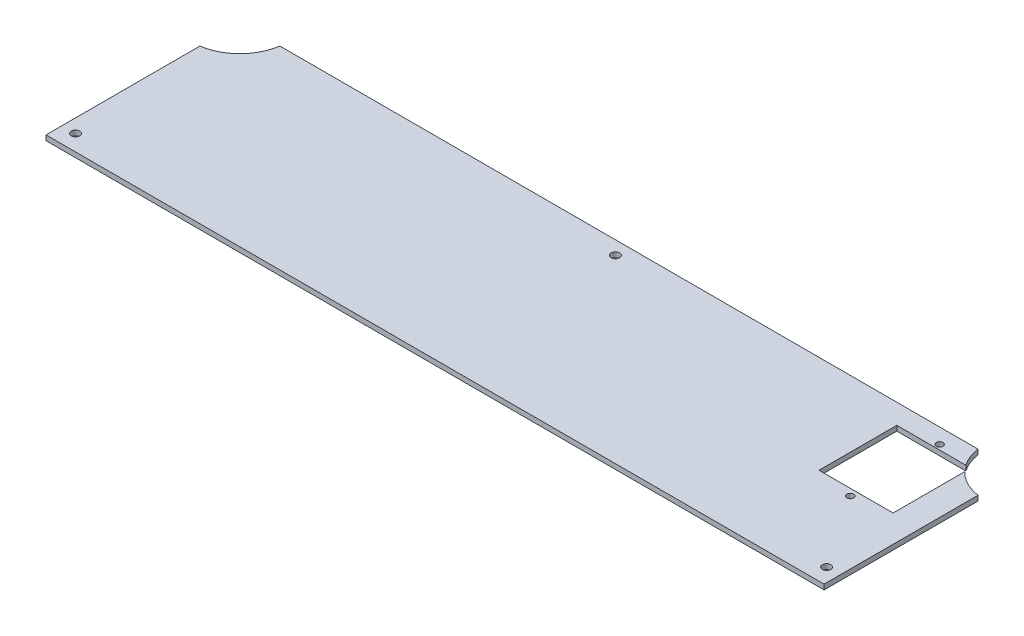
ISO-10303-21;
HEADER;
FILE_DESCRIPTION(('STEP AP214'),'2;1');
FILE_NAME('part.step','',(''),(''),'','','');
FILE_SCHEMA(('AUTOMOTIVE_DESIGN { 1 0 10303 214 1 1 1 1 }'));
ENDSEC;
DATA;
#1=APPLICATION_CONTEXT('core data for automotive mechanical design processes');
#2=APPLICATION_PROTOCOL_DEFINITION('international standard','automotive_design',2000,#1);
#3=PRODUCT_CONTEXT('',#1,'mechanical');
#4=PRODUCT('Part','Part','',(#3));
#5=PRODUCT_RELATED_PRODUCT_CATEGORY('part','',(#4));
#6=PRODUCT_DEFINITION_FORMATION('','',#4);
#7=PRODUCT_DEFINITION_CONTEXT('part definition',#1,'design');
#8=PRODUCT_DEFINITION('design','',#6,#7);
#9=PRODUCT_DEFINITION_SHAPE('','',#8);
#10=(LENGTH_UNIT() NAMED_UNIT(*) SI_UNIT(.MILLI.,.METRE.));
#11=(NAMED_UNIT(*) PLANE_ANGLE_UNIT() SI_UNIT($,.RADIAN.));
#12=(NAMED_UNIT(*) SI_UNIT($,.STERADIAN.) SOLID_ANGLE_UNIT());
#13=UNCERTAINTY_MEASURE_WITH_UNIT(LENGTH_MEASURE(1.E-05),#10,'distance_accuracy_value','');
#14=(GEOMETRIC_REPRESENTATION_CONTEXT(3) GLOBAL_UNCERTAINTY_ASSIGNED_CONTEXT((#13)) GLOBAL_UNIT_ASSIGNED_CONTEXT((#10,
#11,#12)) REPRESENTATION_CONTEXT('',''));
#15=CARTESIAN_POINT('',(0.,0.,0.));
#16=DIRECTION('',(0.,0.,1.));
#17=DIRECTION('',(1.,0.,0.));
#18=AXIS2_PLACEMENT_3D('',#15,#16,#17);
#19=CARTESIAN_POINT('',(234.75,3.,-61.5));
#20=DIRECTION('',(0.,1.,0.));
#21=DIRECTION('',(0.,0.,1.));
#22=AXIS2_PLACEMENT_3D('',#19,#20,#21);
#23=PLANE('',#22);
#24=CARTESIAN_POINT('',(222.75,3.,48.));
#25=DIRECTION('',(0.,1.,0.));
#26=DIRECTION('',(0.,0.,1.));
#27=AXIS2_PLACEMENT_3D('',#24,#25,#26);
#28=CIRCLE('',#27,2.50000000000002);
#29=CARTESIAN_POINT('',(222.75,3.,50.5));
#30=VERTEX_POINT('',#29);
#31=EDGE_CURVE('E281',#30,#30,#28,.T.);
#32=ORIENTED_EDGE('',*,*,#31,.F.);
#33=EDGE_LOOP('',(#32));
#34=FACE_BOUND('',#33,.T.);
#35=CARTESIAN_POINT('',(193.25,3.,-48.5));
#36=DIRECTION('',(0.,1.,0.));
#37=DIRECTION('',(0.,0.,1.));
#38=AXIS2_PLACEMENT_3D('',#35,#36,#37);
#39=CIRCLE('',#38,2.);
#40=CARTESIAN_POINT('',(193.25,3.,-46.5));
#41=VERTEX_POINT('',#40);
#42=EDGE_CURVE('E293',#41,#41,#39,.T.);
#43=ORIENTED_EDGE('',*,*,#42,.F.);
#44=EDGE_LOOP('',(#43));
#45=FACE_BOUND('',#44,.T.);
#46=DIRECTION('',(0.,0.,1.));
#47=VECTOR('',#46,1.);
#48=CARTESIAN_POINT('',(-230.74999999999,3.,-33.7871870789014));
#49=LINE('',#48,#47);
#50=CARTESIAN_POINT('',(-230.74999999999,3.,-33.7871870789014));
#51=VERTEX_POINT('',#50);
#52=CARTESIAN_POINT('',(-230.74999999999,3.,57.4999999999986));
#53=VERTEX_POINT('',#52);
#54=EDGE_CURVE('E169',#51,#53,#49,.T.);
#55=ORIENTED_EDGE('',*,*,#54,.T.);
#56=DIRECTION('',(1.,0.,0.));
#57=VECTOR('',#56,1.);
#58=CARTESIAN_POINT('',(-230.74999999999,3.,57.4999999999986));
#59=LINE('',#58,#57);
#60=CARTESIAN_POINT('',(230.750000000006,3.,57.4999999999951));
#61=VERTEX_POINT('',#60);
#62=EDGE_CURVE('E102',#53,#61,#59,.T.);
#63=ORIENTED_EDGE('',*,*,#62,.T.);
#64=DIRECTION('',(0.,0.,-1.));
#65=VECTOR('',#64,1.);
#66=CARTESIAN_POINT('',(230.750000000006,3.,57.4999999999951));
#67=LINE('',#66,#65);
#68=CARTESIAN_POINT('',(230.750000000006,3.,-33.7871870789035));
#69=VERTEX_POINT('',#68);
#70=EDGE_CURVE('E193',#61,#69,#67,.T.);
#71=ORIENTED_EDGE('',*,*,#70,.T.);
#72=CARTESIAN_POINT('',(234.75,3.,-61.5));
#73=DIRECTION('',(0.,-1.,0.));
#74=DIRECTION('',(0.,0.,1.));
#75=AXIS2_PLACEMENT_3D('',#72,#73,#74);
#76=CIRCLE('',#75,27.9999999999932);
#77=CARTESIAN_POINT('',(214.6745283019,3.,-41.9814079375997));
#78=VERTEX_POINT('',#77);
#79=EDGE_CURVE('E212',#69,#78,#76,.T.);
#80=ORIENTED_EDGE('',*,*,#79,.T.);
#81=DIRECTION('',(0.,0.,1.));
#82=VECTOR('',#81,1.);
#83=CARTESIAN_POINT('',(214.6745283019,3.,-41.9814079376));
#84=LINE('',#83,#82);
#85=CARTESIAN_POINT('',(214.6745283019,3.,0.499999999999998));
#86=VERTEX_POINT('',#85);
#87=EDGE_CURVE('E209',#78,#86,#84,.T.);
#88=ORIENTED_EDGE('',*,*,#87,.T.);
#89=DIRECTION('',(-1.,0.,0.));
#90=VECTOR('',#89,1.);
#91=CARTESIAN_POINT('',(214.6745283019,3.,0.499999999999998));
#92=LINE('',#91,#90);
#93=CARTESIAN_POINT('',(170.75,3.,0.499999999999998));
#94=VERTEX_POINT('',#93);
#95=EDGE_CURVE('E211',#86,#94,#92,.T.);
#96=ORIENTED_EDGE('',*,*,#95,.T.);
#97=DIRECTION('',(0.,0.,-1.));
#98=VECTOR('',#97,1.);
#99=CARTESIAN_POINT('',(170.75,3.,0.499999999999998));
#100=LINE('',#99,#98);
#101=CARTESIAN_POINT('',(170.75,3.,-45.6294583884));
#102=VERTEX_POINT('',#101);
#103=EDGE_CURVE('E214',#94,#102,#100,.T.);
#104=ORIENTED_EDGE('',*,*,#103,.T.);
#105=DIRECTION('',(1.,0.,0.));
#106=VECTOR('',#105,1.);
#107=CARTESIAN_POINT('',(170.75,3.,-45.6294583884));
#108=LINE('',#107,#106);
#109=CARTESIAN_POINT('',(211.6821455494,3.,-45.6294583884));
#110=VERTEX_POINT('',#109);
#111=EDGE_CURVE('E130',#102,#110,#108,.T.);
#112=ORIENTED_EDGE('',*,*,#111,.T.);
#113=CARTESIAN_POINT('',(234.75,3.,-61.5));
#114=DIRECTION('',(0.,-1.,0.));
#115=DIRECTION('',(0.,0.,1.));
#116=AXIS2_PLACEMENT_3D('',#113,#114,#115);
#117=CIRCLE('',#116,27.9999999999929);
#118=CARTESIAN_POINT('',(207.037187078905,3.,-57.5000000000042));
#119=VERTEX_POINT('',#118);
#120=EDGE_CURVE('E124',#110,#119,#117,.T.);
#121=ORIENTED_EDGE('',*,*,#120,.T.);
#122=DIRECTION('',(-1.,0.,0.));
#123=VECTOR('',#122,1.);
#124=CARTESIAN_POINT('',(207.037187078904,3.,-57.5000000000042));
#125=LINE('',#124,#123);
#126=CARTESIAN_POINT('',(-207.03718707889,3.,-57.5000000000007));
#127=VERTEX_POINT('',#126);
#128=EDGE_CURVE('E128',#119,#127,#125,.T.);
#129=ORIENTED_EDGE('',*,*,#128,.T.);
#130=CARTESIAN_POINT('',(-234.74999999999,3.,-61.5000000000014));
#131=DIRECTION('',(0.,-1.,0.));
#132=DIRECTION('',(0.,0.,1.));
#133=AXIS2_PLACEMENT_3D('',#130,#131,#132);
#134=CIRCLE('',#133,27.999999999998);
#135=EDGE_CURVE('E50',#127,#51,#134,.T.);
#136=ORIENTED_EDGE('',*,*,#135,.T.);
#137=EDGE_LOOP('',(#55,#63,#71,#80,#88,#96,#104,#112,#121,#129,#136));
#138=FACE_BOUND('',#137,.T.);
#139=CARTESIAN_POINT('',(0.,3.,-49.5));
#140=DIRECTION('',(0.,1.,0.));
#141=DIRECTION('',(0.,0.,1.));
#142=AXIS2_PLACEMENT_3D('',#139,#140,#141);
#143=CIRCLE('',#142,2.5);
#144=CARTESIAN_POINT('',(0.,3.,-47.));
#145=VERTEX_POINT('',#144);
#146=EDGE_CURVE('E152',#145,#145,#143,.T.);
#147=ORIENTED_EDGE('',*,*,#146,.F.);
#148=EDGE_LOOP('',(#147));
#149=FACE_BOUND('',#148,.T.);
#150=CARTESIAN_POINT('',(193.25,3.,4.5));
#151=DIRECTION('',(0.,1.,0.));
#152=DIRECTION('',(0.,0.,1.));
#153=AXIS2_PLACEMENT_3D('',#150,#151,#152);
#154=CIRCLE('',#153,2.);
#155=CARTESIAN_POINT('',(193.25,3.,6.49999999999999));
#156=VERTEX_POINT('',#155);
#157=EDGE_CURVE('E287',#156,#156,#154,.T.);
#158=ORIENTED_EDGE('',*,*,#157,.F.);
#159=EDGE_LOOP('',(#158));
#160=FACE_BOUND('',#159,.T.);
#161=CARTESIAN_POINT('',(-222.75,3.,48.));
#162=DIRECTION('',(0.,1.,0.));
#163=DIRECTION('',(0.,0.,1.));
#164=AXIS2_PLACEMENT_3D('',#161,#162,#163);
#165=CIRCLE('',#164,2.50000000000002);
#166=CARTESIAN_POINT('',(-222.75,3.,50.5));
#167=VERTEX_POINT('',#166);
#168=EDGE_CURVE('E272',#167,#167,#165,.T.);
#169=ORIENTED_EDGE('',*,*,#168,.F.);
#170=EDGE_LOOP('',(#169));
#171=FACE_BOUND('',#170,.T.);
#172=ADVANCED_FACE('F33',(#34,#45,#138,#149,#160,#171),#23,.T.);
#173=CARTESIAN_POINT('',(234.75,0.,-61.5));
#174=DIRECTION('',(0.,1.,0.));
#175=DIRECTION('',(0.,0.,1.));
#176=AXIS2_PLACEMENT_3D('',#173,#174,#175);
#177=PLANE('',#176);
#178=DIRECTION('',(0.,0.,1.));
#179=VECTOR('',#178,1.);
#180=CARTESIAN_POINT('',(-230.74999999999,0.,-33.7871870789014));
#181=LINE('',#180,#179);
#182=CARTESIAN_POINT('',(-230.74999999999,0.,-33.7871870789014));
#183=VERTEX_POINT('',#182);
#184=CARTESIAN_POINT('',(-230.74999999999,0.,57.4999999999986));
#185=VERTEX_POINT('',#184);
#186=EDGE_CURVE('E148',#183,#185,#181,.T.);
#187=ORIENTED_EDGE('',*,*,#186,.F.);
#188=CARTESIAN_POINT('',(-234.74999999999,0.,-61.5000000000014));
#189=DIRECTION('',(0.,-1.,0.));
#190=DIRECTION('',(0.,0.,1.));
#191=AXIS2_PLACEMENT_3D('',#188,#189,#190);
#192=CIRCLE('',#191,27.999999999998);
#193=CARTESIAN_POINT('',(-207.03718707889,0.,-57.5000000000007));
#194=VERTEX_POINT('',#193);
#195=EDGE_CURVE('E94',#194,#183,#192,.T.);
#196=ORIENTED_EDGE('',*,*,#195,.F.);
#197=DIRECTION('',(-1.,0.,0.));
#198=VECTOR('',#197,1.);
#199=CARTESIAN_POINT('',(207.037187078904,0.,-57.5000000000042));
#200=LINE('',#199,#198);
#201=CARTESIAN_POINT('',(207.037187078905,0.,-57.5000000000042));
#202=VERTEX_POINT('',#201);
#203=EDGE_CURVE('E88',#202,#194,#200,.T.);
#204=ORIENTED_EDGE('',*,*,#203,.F.);
#205=CARTESIAN_POINT('',(234.75,0.,-61.5));
#206=DIRECTION('',(0.,-1.,0.));
#207=DIRECTION('',(0.,0.,1.));
#208=AXIS2_PLACEMENT_3D('',#205,#206,#207);
#209=CIRCLE('',#208,27.9999999999929);
#210=CARTESIAN_POINT('',(211.6821455494,0.,-45.6294583884));
#211=VERTEX_POINT('',#210);
#212=EDGE_CURVE('E138',#211,#202,#209,.T.);
#213=ORIENTED_EDGE('',*,*,#212,.F.);
#214=DIRECTION('',(1.,0.,0.));
#215=VECTOR('',#214,1.);
#216=CARTESIAN_POINT('',(170.75,0.,-45.6294583884));
#217=LINE('',#216,#215);
#218=CARTESIAN_POINT('',(170.75,0.,-45.6294583884));
#219=VERTEX_POINT('',#218);
#220=EDGE_CURVE('E164',#219,#211,#217,.T.);
#221=ORIENTED_EDGE('',*,*,#220,.F.);
#222=DIRECTION('',(0.,0.,-1.));
#223=VECTOR('',#222,1.);
#224=CARTESIAN_POINT('',(170.75,0.,0.499999999999998));
#225=LINE('',#224,#223);
#226=CARTESIAN_POINT('',(170.75,0.,0.499999999999998));
#227=VERTEX_POINT('',#226);
#228=EDGE_CURVE('E162',#227,#219,#225,.T.);
#229=ORIENTED_EDGE('',*,*,#228,.F.);
#230=DIRECTION('',(-1.,0.,0.));
#231=VECTOR('',#230,1.);
#232=CARTESIAN_POINT('',(214.6745283019,0.,0.499999999999998));
#233=LINE('',#232,#231);
#234=CARTESIAN_POINT('',(214.6745283019,0.,0.499999999999998));
#235=VERTEX_POINT('',#234);
#236=EDGE_CURVE('E160',#235,#227,#233,.T.);
#237=ORIENTED_EDGE('',*,*,#236,.F.);
#238=DIRECTION('',(0.,0.,1.));
#239=VECTOR('',#238,1.);
#240=CARTESIAN_POINT('',(214.6745283019,0.,-41.9814079376));
#241=LINE('',#240,#239);
#242=CARTESIAN_POINT('',(214.6745283019,0.,-41.9814079375997));
#243=VERTEX_POINT('',#242);
#244=EDGE_CURVE('E158',#243,#235,#241,.T.);
#245=ORIENTED_EDGE('',*,*,#244,.F.);
#246=CARTESIAN_POINT('',(234.75,0.,-61.5));
#247=DIRECTION('',(0.,-1.,0.));
#248=DIRECTION('',(0.,0.,1.));
#249=AXIS2_PLACEMENT_3D('',#246,#247,#248);
#250=CIRCLE('',#249,27.9999999999932);
#251=CARTESIAN_POINT('',(230.750000000006,0.,-33.7871870789035));
#252=VERTEX_POINT('',#251);
#253=EDGE_CURVE('E156',#252,#243,#250,.T.);
#254=ORIENTED_EDGE('',*,*,#253,.F.);
#255=DIRECTION('',(0.,0.,-1.));
#256=VECTOR('',#255,1.);
#257=CARTESIAN_POINT('',(230.750000000006,0.,57.4999999999951));
#258=LINE('',#257,#256);
#259=CARTESIAN_POINT('',(230.750000000006,0.,57.4999999999951));
#260=VERTEX_POINT('',#259);
#261=EDGE_CURVE('E154',#260,#252,#258,.T.);
#262=ORIENTED_EDGE('',*,*,#261,.F.);
#263=DIRECTION('',(1.,0.,0.));
#264=VECTOR('',#263,1.);
#265=CARTESIAN_POINT('',(-230.74999999999,0.,57.4999999999986));
#266=LINE('',#265,#264);
#267=EDGE_CURVE('E151',#185,#260,#266,.T.);
#268=ORIENTED_EDGE('',*,*,#267,.F.);
#269=EDGE_LOOP('',(#187,#196,#204,#213,#221,#229,#237,#245,#254,#262,#268));
#270=FACE_BOUND('',#269,.T.);
#271=CARTESIAN_POINT('',(0.,0.,-49.5));
#272=DIRECTION('',(0.,1.,0.));
#273=DIRECTION('',(0.,0.,1.));
#274=AXIS2_PLACEMENT_3D('',#271,#272,#273);
#275=CIRCLE('',#274,2.5);
#276=CARTESIAN_POINT('',(0.,0.,-47.));
#277=VERTEX_POINT('',#276);
#278=EDGE_CURVE('E296',#277,#277,#275,.T.);
#279=ORIENTED_EDGE('',*,*,#278,.T.);
#280=EDGE_LOOP('',(#279));
#281=FACE_BOUND('',#280,.T.);
#282=CARTESIAN_POINT('',(193.25,0.,-48.5));
#283=DIRECTION('',(0.,1.,0.));
#284=DIRECTION('',(0.,0.,1.));
#285=AXIS2_PLACEMENT_3D('',#282,#283,#284);
#286=CIRCLE('',#285,2.);
#287=CARTESIAN_POINT('',(193.25,0.,-46.5));
#288=VERTEX_POINT('',#287);
#289=EDGE_CURVE('E290',#288,#288,#286,.T.);
#290=ORIENTED_EDGE('',*,*,#289,.T.);
#291=EDGE_LOOP('',(#290));
#292=FACE_BOUND('',#291,.T.);
#293=CARTESIAN_POINT('',(193.25,0.,4.5));
#294=DIRECTION('',(0.,1.,0.));
#295=DIRECTION('',(0.,0.,1.));
#296=AXIS2_PLACEMENT_3D('',#293,#294,#295);
#297=CIRCLE('',#296,2.);
#298=CARTESIAN_POINT('',(193.25,0.,6.49999999999999));
#299=VERTEX_POINT('',#298);
#300=EDGE_CURVE('E284',#299,#299,#297,.T.);
#301=ORIENTED_EDGE('',*,*,#300,.T.);
#302=EDGE_LOOP('',(#301));
#303=FACE_BOUND('',#302,.T.);
#304=CARTESIAN_POINT('',(222.75,0.,48.));
#305=DIRECTION('',(0.,1.,0.));
#306=DIRECTION('',(0.,0.,1.));
#307=AXIS2_PLACEMENT_3D('',#304,#305,#306);
#308=CIRCLE('',#307,2.50000000000002);
#309=CARTESIAN_POINT('',(222.75,0.,50.5));
#310=VERTEX_POINT('',#309);
#311=EDGE_CURVE('E278',#310,#310,#308,.T.);
#312=ORIENTED_EDGE('',*,*,#311,.T.);
#313=EDGE_LOOP('',(#312));
#314=FACE_BOUND('',#313,.T.);
#315=CARTESIAN_POINT('',(-222.75,0.,48.));
#316=DIRECTION('',(0.,1.,0.));
#317=DIRECTION('',(0.,0.,1.));
#318=AXIS2_PLACEMENT_3D('',#315,#316,#317);
#319=CIRCLE('',#318,2.50000000000002);
#320=CARTESIAN_POINT('',(-222.75,0.,50.5));
#321=VERTEX_POINT('',#320);
#322=EDGE_CURVE('E275',#321,#321,#319,.T.);
#323=ORIENTED_EDGE('',*,*,#322,.T.);
#324=EDGE_LOOP('',(#323));
#325=FACE_BOUND('',#324,.T.);
#326=ADVANCED_FACE('F197',(#270,#281,#292,#303,#314,#325),#177,.F.);
#327=CARTESIAN_POINT('',(-230.74999999999,3.,-33.7871870789014));
#328=DIRECTION('',(1.,0.,0.));
#329=DIRECTION('',(0.,0.,-1.));
#330=AXIS2_PLACEMENT_3D('',#327,#328,#329);
#331=PLANE('',#330);
#332=ORIENTED_EDGE('',*,*,#186,.T.);
#333=DIRECTION('',(0.,-1.,0.));
#334=VECTOR('',#333,1.);
#335=CARTESIAN_POINT('',(-230.74999999999,3.,57.4999999999986));
#336=LINE('',#335,#334);
#337=EDGE_CURVE('E11',#53,#185,#336,.T.);
#338=ORIENTED_EDGE('',*,*,#337,.F.);
#339=ORIENTED_EDGE('',*,*,#54,.F.);
#340=DIRECTION('',(0.,-1.,0.));
#341=VECTOR('',#340,1.);
#342=CARTESIAN_POINT('',(-230.74999999999,3.,-33.7871870789014));
#343=LINE('',#342,#341);
#344=EDGE_CURVE('E144',#51,#183,#343,.T.);
#345=ORIENTED_EDGE('',*,*,#344,.T.);
#346=EDGE_LOOP('',(#332,#338,#339,#345));
#347=FACE_BOUND('',#346,.T.);
#348=ADVANCED_FACE('F35',(#347),#331,.F.);
#349=CARTESIAN_POINT('',(-230.74999999999,3.,57.4999999999986));
#350=DIRECTION('',(0.,0.,-1.));
#351=DIRECTION('',(-1.,0.,0.));
#352=AXIS2_PLACEMENT_3D('',#349,#350,#351);
#353=PLANE('',#352);
#354=ORIENTED_EDGE('',*,*,#267,.T.);
#355=DIRECTION('',(0.,-1.,0.));
#356=VECTOR('',#355,1.);
#357=CARTESIAN_POINT('',(230.750000000006,3.,57.4999999999951));
#358=LINE('',#357,#356);
#359=EDGE_CURVE('E42',#61,#260,#358,.T.);
#360=ORIENTED_EDGE('',*,*,#359,.F.);
#361=ORIENTED_EDGE('',*,*,#62,.F.);
#362=ORIENTED_EDGE('',*,*,#337,.T.);
#363=EDGE_LOOP('',(#354,#360,#361,#362));
#364=FACE_BOUND('',#363,.T.);
#365=ADVANCED_FACE('F405',(#364),#353,.F.);
#366=CARTESIAN_POINT('',(230.750000000006,3.,57.4999999999951));
#367=DIRECTION('',(-1.,0.,0.));
#368=DIRECTION('',(0.,0.,1.));
#369=AXIS2_PLACEMENT_3D('',#366,#367,#368);
#370=PLANE('',#369);
#371=ORIENTED_EDGE('',*,*,#261,.T.);
#372=DIRECTION('',(0.,-1.,0.));
#373=VECTOR('',#372,1.);
#374=CARTESIAN_POINT('',(230.750000000006,3.,-33.7871870789035));
#375=LINE('',#374,#373);
#376=EDGE_CURVE('E185',#69,#252,#375,.T.);
#377=ORIENTED_EDGE('',*,*,#376,.F.);
#378=ORIENTED_EDGE('',*,*,#70,.F.);
#379=ORIENTED_EDGE('',*,*,#359,.T.);
#380=EDGE_LOOP('',(#371,#377,#378,#379));
#381=FACE_BOUND('',#380,.T.);
#382=ADVANCED_FACE('F191',(#381),#370,.F.);
#383=CARTESIAN_POINT('',(234.75,3.,-61.5));
#384=DIRECTION('',(0.,-1.,0.));
#385=DIRECTION('',(0.,0.,-1.));
#386=AXIS2_PLACEMENT_3D('',#383,#384,#385);
#387=CYLINDRICAL_SURFACE('',#386,27.9999999999932);
#388=ORIENTED_EDGE('',*,*,#253,.T.);
#389=DIRECTION('',(0.,-1.,0.));
#390=VECTOR('',#389,1.);
#391=CARTESIAN_POINT('',(214.6745283019,3.,-41.9814079375997));
#392=LINE('',#391,#390);
#393=EDGE_CURVE('E182',#78,#243,#392,.T.);
#394=ORIENTED_EDGE('',*,*,#393,.F.);
#395=ORIENTED_EDGE('',*,*,#79,.F.);
#396=ORIENTED_EDGE('',*,*,#376,.T.);
#397=EDGE_LOOP('',(#388,#394,#395,#396));
#398=FACE_BOUND('',#397,.T.);
#399=ADVANCED_FACE('F203',(#398),#387,.F.);
#400=CARTESIAN_POINT('',(214.6745283019,3.,-41.9814079376));
#401=DIRECTION('',(1.,0.,0.));
#402=DIRECTION('',(0.,0.,-1.));
#403=AXIS2_PLACEMENT_3D('',#400,#401,#402);
#404=PLANE('',#403);
#405=ORIENTED_EDGE('',*,*,#244,.T.);
#406=DIRECTION('',(0.,-1.,0.));
#407=VECTOR('',#406,1.);
#408=CARTESIAN_POINT('',(214.6745283019,3.,0.499999999999998));
#409=LINE('',#408,#407);
#410=EDGE_CURVE('E179',#86,#235,#409,.T.);
#411=ORIENTED_EDGE('',*,*,#410,.F.);
#412=ORIENTED_EDGE('',*,*,#87,.F.);
#413=ORIENTED_EDGE('',*,*,#393,.T.);
#414=EDGE_LOOP('',(#405,#411,#412,#413));
#415=FACE_BOUND('',#414,.T.);
#416=ADVANCED_FACE('F207',(#415),#404,.F.);
#417=CARTESIAN_POINT('',(214.6745283019,3.,0.499999999999998));
#418=DIRECTION('',(0.,0.,1.));
#419=DIRECTION('',(1.,0.,0.));
#420=AXIS2_PLACEMENT_3D('',#417,#418,#419);
#421=PLANE('',#420);
#422=ORIENTED_EDGE('',*,*,#236,.T.);
#423=DIRECTION('',(0.,-1.,0.));
#424=VECTOR('',#423,1.);
#425=CARTESIAN_POINT('',(170.75,3.,0.499999999999998));
#426=LINE('',#425,#424);
#427=EDGE_CURVE('E176',#94,#227,#426,.T.);
#428=ORIENTED_EDGE('',*,*,#427,.F.);
#429=ORIENTED_EDGE('',*,*,#95,.F.);
#430=ORIENTED_EDGE('',*,*,#410,.T.);
#431=EDGE_LOOP('',(#422,#428,#429,#430));
#432=FACE_BOUND('',#431,.T.);
#433=ADVANCED_FACE('F371',(#432),#421,.F.);
#434=CARTESIAN_POINT('',(170.75,3.,0.499999999999998));
#435=DIRECTION('',(-1.,0.,0.));
#436=DIRECTION('',(0.,0.,1.));
#437=AXIS2_PLACEMENT_3D('',#434,#435,#436);
#438=PLANE('',#437);
#439=ORIENTED_EDGE('',*,*,#228,.T.);
#440=DIRECTION('',(0.,-1.,0.));
#441=VECTOR('',#440,1.);
#442=CARTESIAN_POINT('',(170.75,3.,-45.6294583884));
#443=LINE('',#442,#441);
#444=EDGE_CURVE('E173',#102,#219,#443,.T.);
#445=ORIENTED_EDGE('',*,*,#444,.F.);
#446=ORIENTED_EDGE('',*,*,#103,.F.);
#447=ORIENTED_EDGE('',*,*,#427,.T.);
#448=EDGE_LOOP('',(#439,#445,#446,#447));
#449=FACE_BOUND('',#448,.T.);
#450=ADVANCED_FACE('F223',(#449),#438,.F.);
#451=CARTESIAN_POINT('',(170.75,3.,-45.6294583884));
#452=DIRECTION('',(0.,0.,-1.));
#453=DIRECTION('',(-1.,0.,0.));
#454=AXIS2_PLACEMENT_3D('',#451,#452,#453);
#455=PLANE('',#454);
#456=ORIENTED_EDGE('',*,*,#220,.T.);
#457=DIRECTION('',(0.,-1.,0.));
#458=VECTOR('',#457,1.);
#459=CARTESIAN_POINT('',(211.6821455494,3.,-45.6294583884));
#460=LINE('',#459,#458);
#461=EDGE_CURVE('E139',#110,#211,#460,.T.);
#462=ORIENTED_EDGE('',*,*,#461,.F.);
#463=ORIENTED_EDGE('',*,*,#111,.F.);
#464=ORIENTED_EDGE('',*,*,#444,.T.);
#465=EDGE_LOOP('',(#456,#462,#463,#464));
#466=FACE_BOUND('',#465,.T.);
#467=ADVANCED_FACE('F227',(#466),#455,.F.);
#468=CARTESIAN_POINT('',(234.75,3.,-61.5));
#469=DIRECTION('',(0.,-1.,0.));
#470=DIRECTION('',(0.,0.,-1.));
#471=AXIS2_PLACEMENT_3D('',#468,#469,#470);
#472=CYLINDRICAL_SURFACE('',#471,27.9999999999929);
#473=ORIENTED_EDGE('',*,*,#212,.T.);
#474=DIRECTION('',(0.,-1.,0.));
#475=VECTOR('',#474,1.);
#476=CARTESIAN_POINT('',(207.037187078905,3.,-57.5000000000042));
#477=LINE('',#476,#475);
#478=EDGE_CURVE('E135',#119,#202,#477,.T.);
#479=ORIENTED_EDGE('',*,*,#478,.F.);
#480=ORIENTED_EDGE('',*,*,#120,.F.);
#481=ORIENTED_EDGE('',*,*,#461,.T.);
#482=EDGE_LOOP('',(#473,#479,#480,#481));
#483=FACE_BOUND('',#482,.T.);
#484=ADVANCED_FACE('F136',(#483),#472,.F.);
#485=CARTESIAN_POINT('',(207.037187078904,3.,-57.5000000000042));
#486=DIRECTION('',(0.,0.,1.));
#487=DIRECTION('',(1.,0.,0.));
#488=AXIS2_PLACEMENT_3D('',#485,#486,#487);
#489=PLANE('',#488);
#490=ORIENTED_EDGE('',*,*,#203,.T.);
#491=DIRECTION('',(0.,-1.,0.));
#492=VECTOR('',#491,1.);
#493=CARTESIAN_POINT('',(-207.03718707889,3.,-57.5000000000007));
#494=LINE('',#493,#492);
#495=EDGE_CURVE('E140',#127,#194,#494,.T.);
#496=ORIENTED_EDGE('',*,*,#495,.F.);
#497=ORIENTED_EDGE('',*,*,#128,.F.);
#498=ORIENTED_EDGE('',*,*,#478,.T.);
#499=EDGE_LOOP('',(#490,#496,#497,#498));
#500=FACE_BOUND('',#499,.T.);
#501=ADVANCED_FACE('F142',(#500),#489,.F.);
#502=CARTESIAN_POINT('',(-234.74999999999,3.,-61.5000000000014));
#503=DIRECTION('',(0.,-1.,0.));
#504=DIRECTION('',(0.,0.,-1.));
#505=AXIS2_PLACEMENT_3D('',#502,#503,#504);
#506=CYLINDRICAL_SURFACE('',#505,27.999999999998);
#507=ORIENTED_EDGE('',*,*,#195,.T.);
#508=ORIENTED_EDGE('',*,*,#344,.F.);
#509=ORIENTED_EDGE('',*,*,#135,.F.);
#510=ORIENTED_EDGE('',*,*,#495,.T.);
#511=EDGE_LOOP('',(#507,#508,#509,#510));
#512=FACE_BOUND('',#511,.T.);
#513=ADVANCED_FACE('F231',(#512),#506,.F.);
#514=CARTESIAN_POINT('',(0.,3.,-49.5));
#515=DIRECTION('',(0.,-1.,0.));
#516=DIRECTION('',(0.,0.,-1.));
#517=AXIS2_PLACEMENT_3D('',#514,#515,#516);
#518=CYLINDRICAL_SURFACE('',#517,2.5);
#519=ORIENTED_EDGE('',*,*,#146,.T.);
#520=EDGE_LOOP('',(#519));
#521=FACE_BOUND('',#520,.T.);
#522=ORIENTED_EDGE('',*,*,#278,.F.);
#523=EDGE_LOOP('',(#522));
#524=FACE_BOUND('',#523,.T.);
#525=ADVANCED_FACE('F233',(#521,#524),#518,.F.);
#526=CARTESIAN_POINT('',(193.25,3.,-48.5));
#527=DIRECTION('',(0.,-1.,0.));
#528=DIRECTION('',(0.,0.,-1.));
#529=AXIS2_PLACEMENT_3D('',#526,#527,#528);
#530=CYLINDRICAL_SURFACE('',#529,2.);
#531=ORIENTED_EDGE('',*,*,#42,.T.);
#532=EDGE_LOOP('',(#531));
#533=FACE_BOUND('',#532,.T.);
#534=ORIENTED_EDGE('',*,*,#289,.F.);
#535=EDGE_LOOP('',(#534));
#536=FACE_BOUND('',#535,.T.);
#537=ADVANCED_FACE('F239',(#533,#536),#530,.F.);
#538=CARTESIAN_POINT('',(193.25,3.,4.5));
#539=DIRECTION('',(0.,-1.,0.));
#540=DIRECTION('',(0.,0.,-1.));
#541=AXIS2_PLACEMENT_3D('',#538,#539,#540);
#542=CYLINDRICAL_SURFACE('',#541,2.);
#543=ORIENTED_EDGE('',*,*,#157,.T.);
#544=EDGE_LOOP('',(#543));
#545=FACE_BOUND('',#544,.T.);
#546=ORIENTED_EDGE('',*,*,#300,.F.);
#547=EDGE_LOOP('',(#546));
#548=FACE_BOUND('',#547,.T.);
#549=ADVANCED_FACE('F255',(#545,#548),#542,.F.);
#550=CARTESIAN_POINT('',(222.75,3.,48.));
#551=DIRECTION('',(0.,-1.,0.));
#552=DIRECTION('',(0.,0.,-1.));
#553=AXIS2_PLACEMENT_3D('',#550,#551,#552);
#554=CYLINDRICAL_SURFACE('',#553,2.50000000000002);
#555=ORIENTED_EDGE('',*,*,#31,.T.);
#556=EDGE_LOOP('',(#555));
#557=FACE_BOUND('',#556,.T.);
#558=ORIENTED_EDGE('',*,*,#311,.F.);
#559=EDGE_LOOP('',(#558));
#560=FACE_BOUND('',#559,.T.);
#561=ADVANCED_FACE('F259',(#557,#560),#554,.F.);
#562=CARTESIAN_POINT('',(-222.75,3.,48.));
#563=DIRECTION('',(0.,-1.,0.));
#564=DIRECTION('',(0.,0.,-1.));
#565=AXIS2_PLACEMENT_3D('',#562,#563,#564);
#566=CYLINDRICAL_SURFACE('',#565,2.50000000000002);
#567=ORIENTED_EDGE('',*,*,#168,.T.);
#568=EDGE_LOOP('',(#567));
#569=FACE_BOUND('',#568,.T.);
#570=ORIENTED_EDGE('',*,*,#322,.F.);
#571=EDGE_LOOP('',(#570));
#572=FACE_BOUND('',#571,.T.);
#573=ADVANCED_FACE('F263',(#569,#572),#566,.F.);
#574=CLOSED_SHELL('',(#172,#326,#348,#365,#382,#399,#416,#433,#450,#467,#484,#501,#513,#525,
#537,#549,#561,#573));
#575=MANIFOLD_SOLID_BREP('B2',#574);
#576=ADVANCED_BREP_SHAPE_REPRESENTATION('',(#18,#575),#14);
#577=SHAPE_DEFINITION_REPRESENTATION(#9,#576);
ENDSEC;
END-ISO-10303-21;
